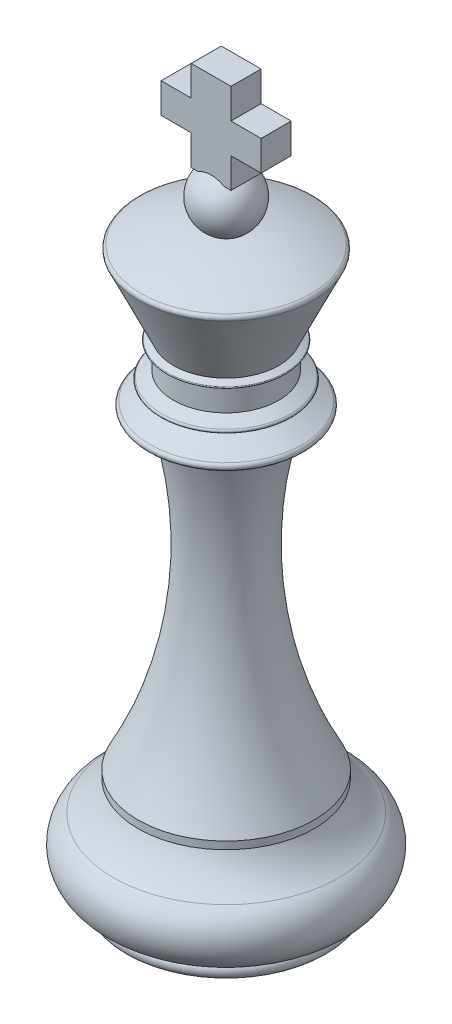
ISO-10303-21;
HEADER;
FILE_DESCRIPTION(('STEP AP214'),'2;1');
FILE_NAME('part.step','',(''),(''),'','','');
FILE_SCHEMA(('AUTOMOTIVE_DESIGN { 1 0 10303 214 1 1 1 1 }'));
ENDSEC;
DATA;
#1=APPLICATION_CONTEXT('core data for automotive mechanical design processes');
#2=APPLICATION_PROTOCOL_DEFINITION('international standard','automotive_design',2000,#1);
#3=PRODUCT_CONTEXT('',#1,'mechanical');
#4=PRODUCT('Part','Part','',(#3));
#5=PRODUCT_RELATED_PRODUCT_CATEGORY('part','',(#4));
#6=PRODUCT_DEFINITION_FORMATION('','',#4);
#7=PRODUCT_DEFINITION_CONTEXT('part definition',#1,'design');
#8=PRODUCT_DEFINITION('design','',#6,#7);
#9=PRODUCT_DEFINITION_SHAPE('','',#8);
#10=(LENGTH_UNIT() NAMED_UNIT(*) SI_UNIT(.MILLI.,.METRE.));
#11=(NAMED_UNIT(*) PLANE_ANGLE_UNIT() SI_UNIT($,.RADIAN.));
#12=(NAMED_UNIT(*) SI_UNIT($,.STERADIAN.) SOLID_ANGLE_UNIT());
#13=UNCERTAINTY_MEASURE_WITH_UNIT(LENGTH_MEASURE(1.E-05),#10,'distance_accuracy_value','');
#14=(GEOMETRIC_REPRESENTATION_CONTEXT(3) GLOBAL_UNCERTAINTY_ASSIGNED_CONTEXT((#13)) GLOBAL_UNIT_ASSIGNED_CONTEXT((#10,
#11,#12)) REPRESENTATION_CONTEXT('',''));
#15=CARTESIAN_POINT('',(0.,0.,0.));
#16=DIRECTION('',(0.,0.,1.));
#17=DIRECTION('',(1.,0.,0.));
#18=AXIS2_PLACEMENT_3D('',#15,#16,#17);
#19=CARTESIAN_POINT('',(0.,81.,0.));
#20=DIRECTION('',(0.,1.,0.));
#21=DIRECTION('',(-1.,0.,0.));
#22=AXIS2_PLACEMENT_3D('',#19,#20,#21);
#23=SPHERICAL_SURFACE('',#22,4.);
#24=CARTESIAN_POINT('',(0.,77.8401729525783,0.));
#25=DIRECTION('',(0.,1.,0.));
#26=DIRECTION('',(0.,0.,1.));
#27=AXIS2_PLACEMENT_3D('',#24,#25,#26);
#28=CIRCLE('',#27,2.45265020546794);
#29=CARTESIAN_POINT('',(0.,77.8401729525783,2.45265020546794));
#30=VERTEX_POINT('',#29);
#31=EDGE_CURVE('E181',#30,#30,#28,.T.);
#32=ORIENTED_EDGE('',*,*,#31,.T.);
#33=EDGE_LOOP('',(#32));
#34=FACE_BOUND('',#33,.T.);
#35=CARTESIAN_POINT('',(0.,84.,0.));
#36=DIRECTION('',(0.,1.,0.));
#37=DIRECTION('',(0.,0.,1.));
#38=AXIS2_PLACEMENT_3D('',#35,#36,#37);
#39=CIRCLE('',#38,2.64575131106459);
#40=CARTESIAN_POINT('',(1.73205080756887,84.,-2.));
#41=VERTEX_POINT('',#40);
#42=CARTESIAN_POINT('',(1.73205080756887,84.,2.));
#43=VERTEX_POINT('',#42);
#44=EDGE_CURVE('E53',#41,#43,#39,.F.);
#45=ORIENTED_EDGE('',*,*,#44,.T.);
#46=CARTESIAN_POINT('',(0.,81.,2.));
#47=DIRECTION('',(0.,0.,-1.));
#48=DIRECTION('',(-1.,0.,0.));
#49=AXIS2_PLACEMENT_3D('',#46,#47,#48);
#50=CIRCLE('',#49,3.46410161513775);
#51=CARTESIAN_POINT('',(-1.73205080756887,84.,2.));
#52=VERTEX_POINT('',#51);
#53=EDGE_CURVE('E11',#43,#52,#50,.F.);
#54=ORIENTED_EDGE('',*,*,#53,.T.);
#55=CARTESIAN_POINT('',(-1.73205080756887,84.,-2.));
#56=VERTEX_POINT('',#55);
#57=EDGE_CURVE('E43',#52,#56,#39,.F.);
#58=ORIENTED_EDGE('',*,*,#57,.T.);
#59=CARTESIAN_POINT('',(0.,81.,-2.));
#60=DIRECTION('',(0.,0.,-1.));
#61=DIRECTION('',(-1.,0.,0.));
#62=AXIS2_PLACEMENT_3D('',#59,#60,#61);
#63=CIRCLE('',#62,3.46410161513775);
#64=EDGE_CURVE('E220',#41,#56,#63,.F.);
#65=ORIENTED_EDGE('',*,*,#64,.F.);
#66=EDGE_LOOP('',(#45,#54,#58,#65));
#67=FACE_BOUND('',#66,.T.);
#68=ADVANCED_FACE('F35',(#34,#67),#23,.T.);
#69=CARTESIAN_POINT('',(0.,55.,0.));
#70=DIRECTION('',(0.,1.,0.));
#71=DIRECTION('',(0.,0.,1.));
#72=AXIS2_PLACEMENT_3D('',#69,#70,#71);
#73=CONICAL_SURFACE('',#72,7.00000000000001,1.10714871779409);
#74=CARTESIAN_POINT('',(0.,56.5527864045,0.));
#75=DIRECTION('',(0.,1.,0.));
#76=DIRECTION('',(0.,0.,1.));
#77=AXIS2_PLACEMENT_3D('',#74,#75,#76);
#78=CIRCLE('',#77,10.1055728090001);
#79=CARTESIAN_POINT('',(0.,56.5527864045,10.1055728090001));
#80=VERTEX_POINT('',#79);
#81=EDGE_CURVE('E217',#80,#80,#78,.T.);
#82=ORIENTED_EDGE('',*,*,#81,.F.);
#83=EDGE_LOOP('',(#82));
#84=FACE_BOUND('',#83,.T.);
#85=CARTESIAN_POINT('',(0.,55.,0.));
#86=DIRECTION('',(0.,1.,0.));
#87=DIRECTION('',(0.,0.,1.));
#88=AXIS2_PLACEMENT_3D('',#85,#86,#87);
#89=CIRCLE('',#88,7.00000000000001);
#90=CARTESIAN_POINT('',(0.,55.,7.00000000000001));
#91=VERTEX_POINT('',#90);
#92=EDGE_CURVE('E158',#91,#91,#89,.T.);
#93=ORIENTED_EDGE('',*,*,#92,.T.);
#94=EDGE_LOOP('',(#93));
#95=FACE_BOUND('',#94,.T.);
#96=ADVANCED_FACE('F37',(#84,#95),#73,.T.);
#97=CARTESIAN_POINT('',(0.,57.,0.));
#98=DIRECTION('',(0.,1.,0.));
#99=DIRECTION('',(0.,0.,1.));
#100=AXIS2_PLACEMENT_3D('',#97,#98,#99);
#101=TOROIDAL_SURFACE('',#100,9.88196601125011,0.500000000000002);
#102=CARTESIAN_POINT('',(0.,57.4472135955,0.));
#103=DIRECTION('',(0.,1.,0.));
#104=DIRECTION('',(0.,0.,1.));
#105=AXIS2_PLACEMENT_3D('',#102,#103,#104);
#106=CIRCLE('',#105,10.1055728090001);
#107=CARTESIAN_POINT('',(0.,57.4472135955,10.1055728090001));
#108=VERTEX_POINT('',#107);
#109=EDGE_CURVE('E214',#108,#108,#106,.T.);
#110=ORIENTED_EDGE('',*,*,#109,.F.);
#111=EDGE_LOOP('',(#110));
#112=FACE_BOUND('',#111,.T.);
#113=ORIENTED_EDGE('',*,*,#81,.T.);
#114=EDGE_LOOP('',(#113));
#115=FACE_BOUND('',#114,.T.);
#116=ADVANCED_FACE('F358',(#112,#115),#101,.T.);
#117=CARTESIAN_POINT('',(0.,57.4472135955,0.));
#118=DIRECTION('',(0.,-1.,0.));
#119=DIRECTION('',(0.,0.,-1.));
#120=AXIS2_PLACEMENT_3D('',#117,#118,#119);
#121=CONICAL_SURFACE('',#120,10.1055728090001,1.10714871779409);
#122=CARTESIAN_POINT('',(0.,59.,0.));
#123=DIRECTION('',(0.,1.,0.));
#124=DIRECTION('',(0.,0.,1.));
#125=AXIS2_PLACEMENT_3D('',#122,#123,#124);
#126=CIRCLE('',#125,7.);
#127=CARTESIAN_POINT('',(0.,59.,7.));
#128=VERTEX_POINT('',#127);
#129=EDGE_CURVE('E211',#128,#128,#126,.T.);
#130=ORIENTED_EDGE('',*,*,#129,.F.);
#131=EDGE_LOOP('',(#130));
#132=FACE_BOUND('',#131,.T.);
#133=ORIENTED_EDGE('',*,*,#109,.T.);
#134=EDGE_LOOP('',(#133));
#135=FACE_BOUND('',#134,.T.);
#136=ADVANCED_FACE('F403',(#132,#135),#121,.T.);
#137=CARTESIAN_POINT('',(0.,59.,0.));
#138=DIRECTION('',(0.,1.,0.));
#139=DIRECTION('',(0.,0.,1.));
#140=AXIS2_PLACEMENT_3D('',#137,#138,#139);
#141=CONICAL_SURFACE('',#140,7.,1.10714871779409);
#142=CARTESIAN_POINT('',(0.,59.77639320225,0.));
#143=DIRECTION('',(0.,1.,0.));
#144=DIRECTION('',(0.,0.,1.));
#145=AXIS2_PLACEMENT_3D('',#142,#143,#144);
#146=CIRCLE('',#145,8.55278640450005);
#147=CARTESIAN_POINT('',(0.,59.77639320225,8.55278640450005));
#148=VERTEX_POINT('',#147);
#149=EDGE_CURVE('E208',#148,#148,#146,.T.);
#150=ORIENTED_EDGE('',*,*,#149,.F.);
#151=EDGE_LOOP('',(#150));
#152=FACE_BOUND('',#151,.T.);
#153=ORIENTED_EDGE('',*,*,#129,.T.);
#154=EDGE_LOOP('',(#153));
#155=FACE_BOUND('',#154,.T.);
#156=ADVANCED_FACE('F399',(#152,#155),#141,.T.);
#157=CARTESIAN_POINT('',(0.,60.,0.));
#158=DIRECTION('',(0.,1.,0.));
#159=DIRECTION('',(0.,0.,1.));
#160=AXIS2_PLACEMENT_3D('',#157,#158,#159);
#161=TOROIDAL_SURFACE('',#160,8.44098300562506,0.249999999999998);
#162=CARTESIAN_POINT('',(0.,60.22360679775,0.));
#163=DIRECTION('',(0.,1.,0.));
#164=DIRECTION('',(0.,0.,1.));
#165=AXIS2_PLACEMENT_3D('',#162,#163,#164);
#166=CIRCLE('',#165,8.55278640450004);
#167=CARTESIAN_POINT('',(0.,60.22360679775,8.55278640450004));
#168=VERTEX_POINT('',#167);
#169=EDGE_CURVE('E205',#168,#168,#166,.T.);
#170=ORIENTED_EDGE('',*,*,#169,.F.);
#171=EDGE_LOOP('',(#170));
#172=FACE_BOUND('',#171,.T.);
#173=ORIENTED_EDGE('',*,*,#149,.T.);
#174=EDGE_LOOP('',(#173));
#175=FACE_BOUND('',#174,.T.);
#176=ADVANCED_FACE('F395',(#172,#175),#161,.T.);
#177=CARTESIAN_POINT('',(0.,60.22360679775,0.));
#178=DIRECTION('',(0.,-1.,0.));
#179=DIRECTION('',(0.,0.,-1.));
#180=AXIS2_PLACEMENT_3D('',#177,#178,#179);
#181=CONICAL_SURFACE('',#180,8.55278640450004,1.10714871779409);
#182=CARTESIAN_POINT('',(0.,61.,0.));
#183=DIRECTION('',(0.,1.,0.));
#184=DIRECTION('',(0.,0.,1.));
#185=AXIS2_PLACEMENT_3D('',#182,#183,#184);
#186=CIRCLE('',#185,7.);
#187=CARTESIAN_POINT('',(0.,61.,7.));
#188=VERTEX_POINT('',#187);
#189=EDGE_CURVE('E202',#188,#188,#186,.T.);
#190=ORIENTED_EDGE('',*,*,#189,.F.);
#191=EDGE_LOOP('',(#190));
#192=FACE_BOUND('',#191,.T.);
#193=ORIENTED_EDGE('',*,*,#169,.T.);
#194=EDGE_LOOP('',(#193));
#195=FACE_BOUND('',#194,.T.);
#196=ADVANCED_FACE('F391',(#192,#195),#181,.T.);
#197=CARTESIAN_POINT('',(0.,91.1598504758133,0.));
#198=DIRECTION('',(0.,1.,0.));
#199=DIRECTION('',(0.,0.,1.));
#200=AXIS2_PLACEMENT_3D('',#197,#198,#199);
#201=CYLINDRICAL_SURFACE('',#200,7.);
#202=CARTESIAN_POINT('',(0.,64.,0.));
#203=DIRECTION('',(0.,1.,0.));
#204=DIRECTION('',(0.,0.,1.));
#205=AXIS2_PLACEMENT_3D('',#202,#203,#204);
#206=CIRCLE('',#205,7.);
#207=CARTESIAN_POINT('',(0.,64.,7.));
#208=VERTEX_POINT('',#207);
#209=EDGE_CURVE('E199',#208,#208,#206,.T.);
#210=ORIENTED_EDGE('',*,*,#209,.F.);
#211=EDGE_LOOP('',(#210));
#212=FACE_BOUND('',#211,.T.);
#213=ORIENTED_EDGE('',*,*,#189,.T.);
#214=EDGE_LOOP('',(#213));
#215=FACE_BOUND('',#214,.T.);
#216=ADVANCED_FACE('F387',(#212,#215),#201,.T.);
#217=CARTESIAN_POINT('',(0.,64.,0.));
#218=DIRECTION('',(0.,1.,0.));
#219=DIRECTION('',(0.,0.,1.));
#220=AXIS2_PLACEMENT_3D('',#217,#218,#219);
#221=CONICAL_SURFACE('',#220,7.,1.1071487177941);
#222=CARTESIAN_POINT('',(0.,64.4105572809,0.));
#223=DIRECTION('',(0.,1.,0.));
#224=DIRECTION('',(0.,0.,1.));
#225=AXIS2_PLACEMENT_3D('',#222,#223,#224);
#226=CIRCLE('',#225,7.82111456180003);
#227=CARTESIAN_POINT('',(0.,64.4105572809,7.82111456180003));
#228=VERTEX_POINT('',#227);
#229=EDGE_CURVE('E196',#228,#228,#226,.T.);
#230=ORIENTED_EDGE('',*,*,#229,.F.);
#231=EDGE_LOOP('',(#230));
#232=FACE_BOUND('',#231,.T.);
#233=ORIENTED_EDGE('',*,*,#209,.T.);
#234=EDGE_LOOP('',(#233));
#235=FACE_BOUND('',#234,.T.);
#236=ADVANCED_FACE('F383',(#232,#235),#221,.T.);
#237=CARTESIAN_POINT('',(0.,64.5,0.));
#238=DIRECTION('',(0.,1.,0.));
#239=DIRECTION('',(0.,0.,1.));
#240=AXIS2_PLACEMENT_3D('',#237,#238,#239);
#241=TOROIDAL_SURFACE('',#240,7.77639320225003,0.100000000000004);
#242=CARTESIAN_POINT('',(0.,64.5894427191,0.));
#243=DIRECTION('',(0.,1.,0.));
#244=DIRECTION('',(0.,0.,1.));
#245=AXIS2_PLACEMENT_3D('',#242,#243,#244);
#246=CIRCLE('',#245,7.82111456180002);
#247=CARTESIAN_POINT('',(0.,64.5894427191,7.82111456180002));
#248=VERTEX_POINT('',#247);
#249=EDGE_CURVE('E193',#248,#248,#246,.T.);
#250=ORIENTED_EDGE('',*,*,#249,.F.);
#251=EDGE_LOOP('',(#250));
#252=FACE_BOUND('',#251,.T.);
#253=ORIENTED_EDGE('',*,*,#229,.T.);
#254=EDGE_LOOP('',(#253));
#255=FACE_BOUND('',#254,.T.);
#256=ADVANCED_FACE('F379',(#252,#255),#241,.T.);
#257=CARTESIAN_POINT('',(0.,64.5894427191,0.));
#258=DIRECTION('',(0.,-1.,0.));
#259=DIRECTION('',(0.,0.,-1.));
#260=AXIS2_PLACEMENT_3D('',#257,#258,#259);
#261=CONICAL_SURFACE('',#260,7.82111456180002,1.10714871779408);
#262=CARTESIAN_POINT('',(0.,65.,0.));
#263=DIRECTION('',(0.,1.,0.));
#264=DIRECTION('',(0.,0.,1.));
#265=AXIS2_PLACEMENT_3D('',#262,#263,#264);
#266=CIRCLE('',#265,7.);
#267=CARTESIAN_POINT('',(0.,65.,7.));
#268=VERTEX_POINT('',#267);
#269=EDGE_CURVE('E190',#268,#268,#266,.T.);
#270=ORIENTED_EDGE('',*,*,#269,.F.);
#271=EDGE_LOOP('',(#270));
#272=FACE_BOUND('',#271,.T.);
#273=ORIENTED_EDGE('',*,*,#249,.T.);
#274=EDGE_LOOP('',(#273));
#275=FACE_BOUND('',#274,.T.);
#276=ADVANCED_FACE('F375',(#272,#275),#261,.T.);
#277=CARTESIAN_POINT('',(0.,65.,0.));
#278=DIRECTION('',(0.,1.,0.));
#279=DIRECTION('',(0.,0.,1.));
#280=AXIS2_PLACEMENT_3D('',#277,#278,#279);
#281=CONICAL_SURFACE('',#280,7.,0.436332312998576);
#282=CARTESIAN_POINT('',(0.,74.787096875235,0.));
#283=DIRECTION('',(0.,1.,0.));
#284=DIRECTION('',(0.,0.,1.));
#285=AXIS2_PLACEMENT_3D('',#282,#283,#284);
#286=CIRCLE('',#285,11.5637982240269);
#287=CARTESIAN_POINT('',(0.,74.787096875235,11.5637982240269));
#288=VERTEX_POINT('',#287);
#289=EDGE_CURVE('E187',#288,#288,#286,.T.);
#290=ORIENTED_EDGE('',*,*,#289,.F.);
#291=EDGE_LOOP('',(#290));
#292=FACE_BOUND('',#291,.T.);
#293=ORIENTED_EDGE('',*,*,#269,.T.);
#294=EDGE_LOOP('',(#293));
#295=FACE_BOUND('',#294,.T.);
#296=ADVANCED_FACE('F371',(#292,#295),#281,.T.);
#297=CARTESIAN_POINT('',(0.,74.9984060061053,0.));
#298=DIRECTION('',(0.,1.,0.));
#299=DIRECTION('',(0.,0.,1.));
#300=AXIS2_PLACEMENT_3D('',#297,#298,#299);
#301=TOROIDAL_SURFACE('',#300,11.1106443305085,0.499999999999999);
#302=CARTESIAN_POINT('',(0.,75.4551358020621,0.));
#303=DIRECTION('',(0.,1.,0.));
#304=DIRECTION('',(0.,0.,1.));
#305=AXIS2_PLACEMENT_3D('',#302,#303,#304);
#306=CIRCLE('',#305,11.314109053459);
#307=CARTESIAN_POINT('',(0.,75.4551358020621,11.314109053459));
#308=VERTEX_POINT('',#307);
#309=EDGE_CURVE('E184',#308,#308,#306,.T.);
#310=ORIENTED_EDGE('',*,*,#309,.F.);
#311=EDGE_LOOP('',(#310));
#312=FACE_BOUND('',#311,.T.);
#313=ORIENTED_EDGE('',*,*,#289,.T.);
#314=EDGE_LOOP('',(#313));
#315=FACE_BOUND('',#314,.T.);
#316=ADVANCED_FACE('F367',(#312,#315),#301,.T.);
#317=CARTESIAN_POINT('',(0.,48.5080778406138,0.));
#318=DIRECTION('',(0.,1.,0.));
#319=DIRECTION('',(0.,0.,1.));
#320=AXIS2_PLACEMENT_3D('',#317,#318,#319);
#321=DEGENERATE_TOROIDAL_SURFACE('',#320,0.690309600617773,29.5,.F.);
#322=ORIENTED_EDGE('',*,*,#31,.F.);
#323=EDGE_LOOP('',(#322));
#324=FACE_BOUND('',#323,.T.);
#325=ORIENTED_EDGE('',*,*,#309,.T.);
#326=EDGE_LOOP('',(#325));
#327=FACE_BOUND('',#326,.T.);
#328=ADVANCED_FACE('F364',(#324,#327),#321,.F.);
#329=CARTESIAN_POINT('',(0.,0.,0.));
#330=DIRECTION('',(0.,1.,0.));
#331=DIRECTION('',(0.,0.,1.));
#332=AXIS2_PLACEMENT_3D('',#329,#330,#331);
#333=PLANE('',#332);
#334=CARTESIAN_POINT('',(0.,0.,0.));
#335=DIRECTION('',(0.,1.,0.));
#336=DIRECTION('',(0.,0.,1.));
#337=AXIS2_PLACEMENT_3D('',#334,#335,#336);
#338=CIRCLE('',#337,12.5);
#339=CARTESIAN_POINT('',(0.,0.,12.5));
#340=VERTEX_POINT('',#339);
#341=EDGE_CURVE('E178',#340,#340,#338,.T.);
#342=ORIENTED_EDGE('',*,*,#341,.F.);
#343=EDGE_LOOP('',(#342));
#344=FACE_BOUND('',#343,.T.);
#345=ADVANCED_FACE('F362',(#344),#333,.F.);
#346=CARTESIAN_POINT('',(0.,1.,0.));
#347=DIRECTION('',(0.,1.,0.));
#348=DIRECTION('',(0.,0.,1.));
#349=AXIS2_PLACEMENT_3D('',#346,#347,#348);
#350=TOROIDAL_SURFACE('',#349,12.5,1.);
#351=CARTESIAN_POINT('',(0.,2.,0.));
#352=DIRECTION('',(0.,1.,0.));
#353=DIRECTION('',(0.,0.,1.));
#354=AXIS2_PLACEMENT_3D('',#351,#352,#353);
#355=CIRCLE('',#354,12.5);
#356=CARTESIAN_POINT('',(0.,2.,12.5));
#357=VERTEX_POINT('',#356);
#358=EDGE_CURVE('E175',#357,#357,#355,.T.);
#359=ORIENTED_EDGE('',*,*,#358,.F.);
#360=EDGE_LOOP('',(#359));
#361=FACE_BOUND('',#360,.T.);
#362=ORIENTED_EDGE('',*,*,#341,.T.);
#363=EDGE_LOOP('',(#362));
#364=FACE_BOUND('',#363,.T.);
#365=ADVANCED_FACE('F438',(#361,#364),#350,.T.);
#366=CARTESIAN_POINT('',(0.,6.390625,0.));
#367=DIRECTION('',(0.,1.,0.));
#368=DIRECTION('',(0.,0.,1.));
#369=AXIS2_PLACEMENT_3D('',#366,#367,#368);
#370=TOROIDAL_SURFACE('',#369,12.5,4.390625);
#371=CARTESIAN_POINT('',(0.,9.99999999999999,0.));
#372=DIRECTION('',(0.,1.,0.));
#373=DIRECTION('',(0.,0.,1.));
#374=AXIS2_PLACEMENT_3D('',#371,#372,#373);
#375=CIRCLE('',#374,15.);
#376=CARTESIAN_POINT('',(0.,9.99999999999999,15.));
#377=VERTEX_POINT('',#376);
#378=EDGE_CURVE('E172',#377,#377,#375,.T.);
#379=ORIENTED_EDGE('',*,*,#378,.F.);
#380=EDGE_LOOP('',(#379));
#381=FACE_BOUND('',#380,.T.);
#382=ORIENTED_EDGE('',*,*,#358,.T.);
#383=EDGE_LOOP('',(#382));
#384=FACE_BOUND('',#383,.T.);
#385=ADVANCED_FACE('F432',(#381,#384),#370,.T.);
#386=CARTESIAN_POINT('',(0.,17.8096085409253,0.));
#387=DIRECTION('',(0.,1.,0.));
#388=DIRECTION('',(0.,0.,1.));
#389=AXIS2_PLACEMENT_3D('',#386,#387,#388);
#390=TOROIDAL_SURFACE('',#389,20.4092526690391,9.5);
#391=CARTESIAN_POINT('',(0.,14.,0.));
#392=DIRECTION('',(0.,1.,0.));
#393=DIRECTION('',(0.,0.,1.));
#394=AXIS2_PLACEMENT_3D('',#391,#392,#393);
#395=CIRCLE('',#394,11.7065586743666);
#396=CARTESIAN_POINT('',(0.,14.,11.7065586743666));
#397=VERTEX_POINT('',#396);
#398=EDGE_CURVE('E169',#397,#397,#395,.T.);
#399=ORIENTED_EDGE('',*,*,#398,.F.);
#400=EDGE_LOOP('',(#399));
#401=FACE_BOUND('',#400,.T.);
#402=ORIENTED_EDGE('',*,*,#378,.T.);
#403=EDGE_LOOP('',(#402));
#404=FACE_BOUND('',#403,.T.);
#405=ADVANCED_FACE('F426',(#401,#404),#390,.F.);
#406=CARTESIAN_POINT('',(0.,91.1598504758133,0.));
#407=DIRECTION('',(0.,1.,0.));
#408=DIRECTION('',(0.,0.,1.));
#409=AXIS2_PLACEMENT_3D('',#406,#407,#408);
#410=CYLINDRICAL_SURFACE('',#409,11.7065586743666);
#411=CARTESIAN_POINT('',(0.,15.,0.));
#412=DIRECTION('',(0.,1.,0.));
#413=DIRECTION('',(0.,0.,1.));
#414=AXIS2_PLACEMENT_3D('',#411,#412,#413);
#415=CIRCLE('',#414,11.7065586743666);
#416=CARTESIAN_POINT('',(0.,15.,11.7065586743666));
#417=VERTEX_POINT('',#416);
#418=EDGE_CURVE('E161',#417,#417,#415,.T.);
#419=ORIENTED_EDGE('',*,*,#418,.F.);
#420=EDGE_LOOP('',(#419));
#421=FACE_BOUND('',#420,.T.);
#422=ORIENTED_EDGE('',*,*,#398,.T.);
#423=EDGE_LOOP('',(#422));
#424=FACE_BOUND('',#423,.T.);
#425=ADVANCED_FACE('F420',(#421,#424),#410,.T.);
#426=CARTESIAN_POINT('',(0.,40.9808622858206,0.));
#427=DIRECTION('',(0.,1.,0.));
#428=DIRECTION('',(0.,0.,1.));
#429=AXIS2_PLACEMENT_3D('',#426,#427,#428);
#430=TOROIDAL_SURFACE('',#429,60.1833035618405,55.);
#431=ORIENTED_EDGE('',*,*,#92,.F.);
#432=EDGE_LOOP('',(#431));
#433=FACE_BOUND('',#432,.T.);
#434=ORIENTED_EDGE('',*,*,#418,.T.);
#435=EDGE_LOOP('',(#434));
#436=FACE_BOUND('',#435,.T.);
#437=ADVANCED_FACE('F417',(#433,#436),#430,.F.);
#438=CARTESIAN_POINT('',(-2.646,84.,2.));
#439=DIRECTION('',(0.,1.,0.));
#440=DIRECTION('',(0.,0.,1.));
#441=AXIS2_PLACEMENT_3D('',#438,#439,#440);
#442=PLANE('',#441);
#443=ORIENTED_EDGE('',*,*,#57,.F.);
#444=DIRECTION('',(1.,0.,0.));
#445=VECTOR('',#444,1.);
#446=CARTESIAN_POINT('',(-2.646,84.,2.));
#447=LINE('',#446,#445);
#448=CARTESIAN_POINT('',(-2.646,84.,2.));
#449=VERTEX_POINT('',#448);
#450=EDGE_CURVE('E587',#449,#52,#447,.T.);
#451=ORIENTED_EDGE('',*,*,#450,.F.);
#452=DIRECTION('',(0.,0.,-1.));
#453=VECTOR('',#452,1.);
#454=CARTESIAN_POINT('',(-2.646,84.,2.));
#455=LINE('',#454,#453);
#456=CARTESIAN_POINT('',(-2.646,84.,-2.));
#457=VERTEX_POINT('',#456);
#458=EDGE_CURVE('E139',#449,#457,#455,.T.);
#459=ORIENTED_EDGE('',*,*,#458,.T.);
#460=DIRECTION('',(1.,0.,0.));
#461=VECTOR('',#460,1.);
#462=CARTESIAN_POINT('',(-2.646,84.,-2.));
#463=LINE('',#462,#461);
#464=EDGE_CURVE('E228',#457,#56,#463,.T.);
#465=ORIENTED_EDGE('',*,*,#464,.T.);
#466=EDGE_LOOP('',(#443,#451,#459,#465));
#467=FACE_BOUND('',#466,.T.);
#468=ADVANCED_FACE('F231',(#467),#442,.F.);
#469=CARTESIAN_POINT('',(-2.646,88.,2.));
#470=DIRECTION('',(0.,1.,0.));
#471=DIRECTION('',(0.,0.,1.));
#472=AXIS2_PLACEMENT_3D('',#469,#470,#471);
#473=PLANE('',#472);
#474=DIRECTION('',(1.,0.,0.));
#475=VECTOR('',#474,1.);
#476=CARTESIAN_POINT('',(-2.646,88.,-2.));
#477=LINE('',#476,#475);
#478=CARTESIAN_POINT('',(-6.646,88.,-2.));
#479=VERTEX_POINT('',#478);
#480=CARTESIAN_POINT('',(-2.646,88.,-2.));
#481=VERTEX_POINT('',#480);
#482=EDGE_CURVE('E157',#479,#481,#477,.T.);
#483=ORIENTED_EDGE('',*,*,#482,.T.);
#484=DIRECTION('',(0.,0.,-1.));
#485=VECTOR('',#484,1.);
#486=CARTESIAN_POINT('',(-2.646,88.,2.));
#487=LINE('',#486,#485);
#488=CARTESIAN_POINT('',(-2.646,88.,2.));
#489=VERTEX_POINT('',#488);
#490=EDGE_CURVE('E136',#489,#481,#487,.T.);
#491=ORIENTED_EDGE('',*,*,#490,.F.);
#492=DIRECTION('',(1.,0.,0.));
#493=VECTOR('',#492,1.);
#494=CARTESIAN_POINT('',(-2.646,88.,2.));
#495=LINE('',#494,#493);
#496=CARTESIAN_POINT('',(-6.646,88.,2.));
#497=VERTEX_POINT('',#496);
#498=EDGE_CURVE('E144',#497,#489,#495,.T.);
#499=ORIENTED_EDGE('',*,*,#498,.F.);
#500=DIRECTION('',(0.,0.,-1.));
#501=VECTOR('',#500,1.);
#502=CARTESIAN_POINT('',(-6.646,88.,2.));
#503=LINE('',#502,#501);
#504=EDGE_CURVE('E254',#497,#479,#503,.T.);
#505=ORIENTED_EDGE('',*,*,#504,.T.);
#506=EDGE_LOOP('',(#483,#491,#499,#505));
#507=FACE_BOUND('',#506,.T.);
#508=ADVANCED_FACE('F155',(#507),#473,.F.);
#509=CARTESIAN_POINT('',(-2.646,84.,2.));
#510=DIRECTION('',(1.,0.,0.));
#511=DIRECTION('',(0.,0.,-1.));
#512=AXIS2_PLACEMENT_3D('',#509,#510,#511);
#513=PLANE('',#512);
#514=DIRECTION('',(0.,-1.,0.));
#515=VECTOR('',#514,1.);
#516=CARTESIAN_POINT('',(-2.646,84.,-2.));
#517=LINE('',#516,#515);
#518=EDGE_CURVE('E236',#481,#457,#517,.T.);
#519=ORIENTED_EDGE('',*,*,#518,.T.);
#520=ORIENTED_EDGE('',*,*,#458,.F.);
#521=DIRECTION('',(0.,-1.,0.));
#522=VECTOR('',#521,1.);
#523=CARTESIAN_POINT('',(-2.646,84.,2.));
#524=LINE('',#523,#522);
#525=EDGE_CURVE('E132',#489,#449,#524,.T.);
#526=ORIENTED_EDGE('',*,*,#525,.F.);
#527=ORIENTED_EDGE('',*,*,#490,.T.);
#528=EDGE_LOOP('',(#519,#520,#526,#527));
#529=FACE_BOUND('',#528,.T.);
#530=ADVANCED_FACE('F134',(#529),#513,.F.);
#531=ORIENTED_EDGE('',*,*,#44,.F.);
#532=CARTESIAN_POINT('',(2.646,84.,-2.));
#533=VERTEX_POINT('',#532);
#534=EDGE_CURVE('E230',#41,#533,#463,.T.);
#535=ORIENTED_EDGE('',*,*,#534,.T.);
#536=DIRECTION('',(0.,0.,-1.));
#537=VECTOR('',#536,1.);
#538=CARTESIAN_POINT('',(2.646,84.,2.));
#539=LINE('',#538,#537);
#540=CARTESIAN_POINT('',(2.646,84.,2.));
#541=VERTEX_POINT('',#540);
#542=EDGE_CURVE('E163',#541,#533,#539,.T.);
#543=ORIENTED_EDGE('',*,*,#542,.F.);
#544=EDGE_CURVE('E143',#43,#541,#447,.T.);
#545=ORIENTED_EDGE('',*,*,#544,.F.);
#546=EDGE_LOOP('',(#531,#535,#543,#545));
#547=FACE_BOUND('',#546,.T.);
#548=ADVANCED_FACE('F481',(#547),#442,.F.);
#549=CARTESIAN_POINT('',(2.646,84.,2.));
#550=DIRECTION('',(-1.,0.,0.));
#551=DIRECTION('',(0.,0.,1.));
#552=AXIS2_PLACEMENT_3D('',#549,#550,#551);
#553=PLANE('',#552);
#554=DIRECTION('',(0.,1.,0.));
#555=VECTOR('',#554,1.);
#556=CARTESIAN_POINT('',(2.646,84.,-2.));
#557=LINE('',#556,#555);
#558=CARTESIAN_POINT('',(2.646,88.,-2.));
#559=VERTEX_POINT('',#558);
#560=EDGE_CURVE('E232',#533,#559,#557,.T.);
#561=ORIENTED_EDGE('',*,*,#560,.T.);
#562=DIRECTION('',(0.,0.,-1.));
#563=VECTOR('',#562,1.);
#564=CARTESIAN_POINT('',(2.646,88.,2.));
#565=LINE('',#564,#563);
#566=CARTESIAN_POINT('',(2.646,88.,2.));
#567=VERTEX_POINT('',#566);
#568=EDGE_CURVE('E277',#567,#559,#565,.T.);
#569=ORIENTED_EDGE('',*,*,#568,.F.);
#570=DIRECTION('',(0.,1.,0.));
#571=VECTOR('',#570,1.);
#572=CARTESIAN_POINT('',(2.646,84.,2.));
#573=LINE('',#572,#571);
#574=EDGE_CURVE('E285',#541,#567,#573,.T.);
#575=ORIENTED_EDGE('',*,*,#574,.F.);
#576=ORIENTED_EDGE('',*,*,#542,.T.);
#577=EDGE_LOOP('',(#561,#569,#575,#576));
#578=FACE_BOUND('',#577,.T.);
#579=ADVANCED_FACE('F283',(#578),#553,.F.);
#580=CARTESIAN_POINT('',(2.646,88.,2.));
#581=DIRECTION('',(0.,1.,0.));
#582=DIRECTION('',(0.,0.,1.));
#583=AXIS2_PLACEMENT_3D('',#580,#581,#582);
#584=PLANE('',#583);
#585=DIRECTION('',(1.,0.,0.));
#586=VECTOR('',#585,1.);
#587=CARTESIAN_POINT('',(2.646,88.,-2.));
#588=LINE('',#587,#586);
#589=CARTESIAN_POINT('',(6.646,88.,-2.));
#590=VERTEX_POINT('',#589);
#591=EDGE_CURVE('E234',#559,#590,#588,.T.);
#592=ORIENTED_EDGE('',*,*,#591,.T.);
#593=DIRECTION('',(0.,0.,-1.));
#594=VECTOR('',#593,1.);
#595=CARTESIAN_POINT('',(6.646,88.,2.));
#596=LINE('',#595,#594);
#597=CARTESIAN_POINT('',(6.646,88.,2.));
#598=VERTEX_POINT('',#597);
#599=EDGE_CURVE('E274',#598,#590,#596,.T.);
#600=ORIENTED_EDGE('',*,*,#599,.F.);
#601=DIRECTION('',(1.,0.,0.));
#602=VECTOR('',#601,1.);
#603=CARTESIAN_POINT('',(2.646,88.,2.));
#604=LINE('',#603,#602);
#605=EDGE_CURVE('E302',#567,#598,#604,.T.);
#606=ORIENTED_EDGE('',*,*,#605,.F.);
#607=ORIENTED_EDGE('',*,*,#568,.T.);
#608=EDGE_LOOP('',(#592,#600,#606,#607));
#609=FACE_BOUND('',#608,.T.);
#610=ADVANCED_FACE('F293',(#609),#584,.F.);
#611=CARTESIAN_POINT('',(6.646,88.,2.));
#612=DIRECTION('',(-1.,0.,0.));
#613=DIRECTION('',(0.,-1.,0.));
#614=AXIS2_PLACEMENT_3D('',#611,#612,#613);
#615=PLANE('',#614);
#616=DIRECTION('',(0.,1.,0.));
#617=VECTOR('',#616,1.);
#618=CARTESIAN_POINT('',(6.646,88.,-2.));
#619=LINE('',#618,#617);
#620=CARTESIAN_POINT('',(6.646,92.,-2.));
#621=VERTEX_POINT('',#620);
#622=EDGE_CURVE('E241',#590,#621,#619,.T.);
#623=ORIENTED_EDGE('',*,*,#622,.T.);
#624=DIRECTION('',(0.,0.,-1.));
#625=VECTOR('',#624,1.);
#626=CARTESIAN_POINT('',(6.646,92.,2.));
#627=LINE('',#626,#625);
#628=CARTESIAN_POINT('',(6.646,92.,2.));
#629=VERTEX_POINT('',#628);
#630=EDGE_CURVE('E271',#629,#621,#627,.T.);
#631=ORIENTED_EDGE('',*,*,#630,.F.);
#632=DIRECTION('',(0.,1.,0.));
#633=VECTOR('',#632,1.);
#634=CARTESIAN_POINT('',(6.646,88.,2.));
#635=LINE('',#634,#633);
#636=EDGE_CURVE('E299',#598,#629,#635,.T.);
#637=ORIENTED_EDGE('',*,*,#636,.F.);
#638=ORIENTED_EDGE('',*,*,#599,.T.);
#639=EDGE_LOOP('',(#623,#631,#637,#638));
#640=FACE_BOUND('',#639,.T.);
#641=ADVANCED_FACE('F297',(#640),#615,.F.);
#642=CARTESIAN_POINT('',(6.646,92.,2.));
#643=DIRECTION('',(0.,-1.,0.));
#644=DIRECTION('',(0.,0.,-1.));
#645=AXIS2_PLACEMENT_3D('',#642,#643,#644);
#646=PLANE('',#645);
#647=DIRECTION('',(-1.,0.,0.));
#648=VECTOR('',#647,1.);
#649=CARTESIAN_POINT('',(6.646,92.,-2.));
#650=LINE('',#649,#648);
#651=CARTESIAN_POINT('',(2.646,92.,-2.));
#652=VERTEX_POINT('',#651);
#653=EDGE_CURVE('E243',#621,#652,#650,.T.);
#654=ORIENTED_EDGE('',*,*,#653,.T.);
#655=DIRECTION('',(0.,0.,-1.));
#656=VECTOR('',#655,1.);
#657=CARTESIAN_POINT('',(2.646,92.,2.));
#658=LINE('',#657,#656);
#659=CARTESIAN_POINT('',(2.646,92.,2.));
#660=VERTEX_POINT('',#659);
#661=EDGE_CURVE('E268',#660,#652,#658,.T.);
#662=ORIENTED_EDGE('',*,*,#661,.F.);
#663=DIRECTION('',(-1.,0.,0.));
#664=VECTOR('',#663,1.);
#665=CARTESIAN_POINT('',(6.646,92.,2.));
#666=LINE('',#665,#664);
#667=EDGE_CURVE('E301',#629,#660,#666,.T.);
#668=ORIENTED_EDGE('',*,*,#667,.F.);
#669=ORIENTED_EDGE('',*,*,#630,.T.);
#670=EDGE_LOOP('',(#654,#662,#668,#669));
#671=FACE_BOUND('',#670,.T.);
#672=ADVANCED_FACE('F341',(#671),#646,.F.);
#673=CARTESIAN_POINT('',(2.646,92.,2.));
#674=DIRECTION('',(-1.,0.,0.));
#675=DIRECTION('',(0.,-1.,0.));
#676=AXIS2_PLACEMENT_3D('',#673,#674,#675);
#677=PLANE('',#676);
#678=DIRECTION('',(0.,1.,0.));
#679=VECTOR('',#678,1.);
#680=CARTESIAN_POINT('',(2.646,92.,-2.));
#681=LINE('',#680,#679);
#682=CARTESIAN_POINT('',(2.646,96.,-2.));
#683=VERTEX_POINT('',#682);
#684=EDGE_CURVE('E245',#652,#683,#681,.T.);
#685=ORIENTED_EDGE('',*,*,#684,.T.);
#686=DIRECTION('',(0.,0.,-1.));
#687=VECTOR('',#686,1.);
#688=CARTESIAN_POINT('',(2.646,96.,2.));
#689=LINE('',#688,#687);
#690=CARTESIAN_POINT('',(2.646,96.,2.));
#691=VERTEX_POINT('',#690);
#692=EDGE_CURVE('E265',#691,#683,#689,.T.);
#693=ORIENTED_EDGE('',*,*,#692,.F.);
#694=DIRECTION('',(0.,1.,0.));
#695=VECTOR('',#694,1.);
#696=CARTESIAN_POINT('',(2.646,92.,2.));
#697=LINE('',#696,#695);
#698=EDGE_CURVE('E304',#660,#691,#697,.T.);
#699=ORIENTED_EDGE('',*,*,#698,.F.);
#700=ORIENTED_EDGE('',*,*,#661,.T.);
#701=EDGE_LOOP('',(#685,#693,#699,#700));
#702=FACE_BOUND('',#701,.T.);
#703=ADVANCED_FACE('F338',(#702),#677,.F.);
#704=CARTESIAN_POINT('',(2.646,96.,2.));
#705=DIRECTION('',(0.,-1.,0.));
#706=DIRECTION('',(0.,0.,-1.));
#707=AXIS2_PLACEMENT_3D('',#704,#705,#706);
#708=PLANE('',#707);
#709=DIRECTION('',(-1.,0.,0.));
#710=VECTOR('',#709,1.);
#711=CARTESIAN_POINT('',(2.646,96.,-2.));
#712=LINE('',#711,#710);
#713=CARTESIAN_POINT('',(-2.646,96.,-2.));
#714=VERTEX_POINT('',#713);
#715=EDGE_CURVE('E247',#683,#714,#712,.T.);
#716=ORIENTED_EDGE('',*,*,#715,.T.);
#717=DIRECTION('',(0.,0.,-1.));
#718=VECTOR('',#717,1.);
#719=CARTESIAN_POINT('',(-2.646,96.,2.));
#720=LINE('',#719,#718);
#721=CARTESIAN_POINT('',(-2.646,96.,2.));
#722=VERTEX_POINT('',#721);
#723=EDGE_CURVE('E262',#722,#714,#720,.T.);
#724=ORIENTED_EDGE('',*,*,#723,.F.);
#725=DIRECTION('',(-1.,0.,0.));
#726=VECTOR('',#725,1.);
#727=CARTESIAN_POINT('',(2.646,96.,2.));
#728=LINE('',#727,#726);
#729=EDGE_CURVE('E310',#691,#722,#728,.T.);
#730=ORIENTED_EDGE('',*,*,#729,.F.);
#731=ORIENTED_EDGE('',*,*,#692,.T.);
#732=EDGE_LOOP('',(#716,#724,#730,#731));
#733=FACE_BOUND('',#732,.T.);
#734=ADVANCED_FACE('F333',(#733),#708,.F.);
#735=CARTESIAN_POINT('',(-2.646,92.,2.));
#736=DIRECTION('',(1.,0.,0.));
#737=DIRECTION('',(0.,1.,0.));
#738=AXIS2_PLACEMENT_3D('',#735,#736,#737);
#739=PLANE('',#738);
#740=DIRECTION('',(0.,-1.,0.));
#741=VECTOR('',#740,1.);
#742=CARTESIAN_POINT('',(-2.646,92.,-2.));
#743=LINE('',#742,#741);
#744=CARTESIAN_POINT('',(-2.646,92.,-2.));
#745=VERTEX_POINT('',#744);
#746=EDGE_CURVE('E249',#714,#745,#743,.T.);
#747=ORIENTED_EDGE('',*,*,#746,.T.);
#748=DIRECTION('',(0.,0.,-1.));
#749=VECTOR('',#748,1.);
#750=CARTESIAN_POINT('',(-2.646,92.,2.));
#751=LINE('',#750,#749);
#752=CARTESIAN_POINT('',(-2.646,92.,2.));
#753=VERTEX_POINT('',#752);
#754=EDGE_CURVE('E259',#753,#745,#751,.T.);
#755=ORIENTED_EDGE('',*,*,#754,.F.);
#756=DIRECTION('',(0.,-1.,0.));
#757=VECTOR('',#756,1.);
#758=CARTESIAN_POINT('',(-2.646,92.,2.));
#759=LINE('',#758,#757);
#760=EDGE_CURVE('E312',#722,#753,#759,.T.);
#761=ORIENTED_EDGE('',*,*,#760,.F.);
#762=ORIENTED_EDGE('',*,*,#723,.T.);
#763=EDGE_LOOP('',(#747,#755,#761,#762));
#764=FACE_BOUND('',#763,.T.);
#765=ADVANCED_FACE('F328',(#764),#739,.F.);
#766=CARTESIAN_POINT('',(-6.646,92.,2.));
#767=DIRECTION('',(0.,-1.,0.));
#768=DIRECTION('',(0.,0.,-1.));
#769=AXIS2_PLACEMENT_3D('',#766,#767,#768);
#770=PLANE('',#769);
#771=DIRECTION('',(-1.,0.,0.));
#772=VECTOR('',#771,1.);
#773=CARTESIAN_POINT('',(-6.646,92.,-2.));
#774=LINE('',#773,#772);
#775=CARTESIAN_POINT('',(-6.646,92.,-2.));
#776=VERTEX_POINT('',#775);
#777=EDGE_CURVE('E251',#745,#776,#774,.T.);
#778=ORIENTED_EDGE('',*,*,#777,.T.);
#779=DIRECTION('',(0.,0.,-1.));
#780=VECTOR('',#779,1.);
#781=CARTESIAN_POINT('',(-6.646,92.,2.));
#782=LINE('',#781,#780);
#783=CARTESIAN_POINT('',(-6.646,92.,2.));
#784=VERTEX_POINT('',#783);
#785=EDGE_CURVE('E256',#784,#776,#782,.T.);
#786=ORIENTED_EDGE('',*,*,#785,.F.);
#787=DIRECTION('',(-1.,0.,0.));
#788=VECTOR('',#787,1.);
#789=CARTESIAN_POINT('',(-6.646,92.,2.));
#790=LINE('',#789,#788);
#791=EDGE_CURVE('E314',#753,#784,#790,.T.);
#792=ORIENTED_EDGE('',*,*,#791,.F.);
#793=ORIENTED_EDGE('',*,*,#754,.T.);
#794=EDGE_LOOP('',(#778,#786,#792,#793));
#795=FACE_BOUND('',#794,.T.);
#796=ADVANCED_FACE('F324',(#795),#770,.F.);
#797=CARTESIAN_POINT('',(-6.646,88.,2.));
#798=DIRECTION('',(1.,0.,0.));
#799=DIRECTION('',(0.,1.,0.));
#800=AXIS2_PLACEMENT_3D('',#797,#798,#799);
#801=PLANE('',#800);
#802=DIRECTION('',(0.,-1.,0.));
#803=VECTOR('',#802,1.);
#804=CARTESIAN_POINT('',(-6.646,88.,-2.));
#805=LINE('',#804,#803);
#806=EDGE_CURVE('E153',#776,#479,#805,.T.);
#807=ORIENTED_EDGE('',*,*,#806,.T.);
#808=ORIENTED_EDGE('',*,*,#504,.F.);
#809=DIRECTION('',(0.,-1.,0.));
#810=VECTOR('',#809,1.);
#811=CARTESIAN_POINT('',(-6.646,88.,2.));
#812=LINE('',#811,#810);
#813=EDGE_CURVE('E149',#784,#497,#812,.T.);
#814=ORIENTED_EDGE('',*,*,#813,.F.);
#815=ORIENTED_EDGE('',*,*,#785,.T.);
#816=EDGE_LOOP('',(#807,#808,#814,#815));
#817=FACE_BOUND('',#816,.T.);
#818=ADVANCED_FACE('F320',(#817),#801,.F.);
#819=CARTESIAN_POINT('',(0.,0.,2.));
#820=DIRECTION('',(0.,0.,-1.));
#821=DIRECTION('',(-1.,0.,0.));
#822=AXIS2_PLACEMENT_3D('',#819,#820,#821);
#823=PLANE('',#822);
#824=ORIENTED_EDGE('',*,*,#53,.F.);
#825=ORIENTED_EDGE('',*,*,#544,.T.);
#826=ORIENTED_EDGE('',*,*,#574,.T.);
#827=ORIENTED_EDGE('',*,*,#605,.T.);
#828=ORIENTED_EDGE('',*,*,#636,.T.);
#829=ORIENTED_EDGE('',*,*,#667,.T.);
#830=ORIENTED_EDGE('',*,*,#698,.T.);
#831=ORIENTED_EDGE('',*,*,#729,.T.);
#832=ORIENTED_EDGE('',*,*,#760,.T.);
#833=ORIENTED_EDGE('',*,*,#791,.T.);
#834=ORIENTED_EDGE('',*,*,#813,.T.);
#835=ORIENTED_EDGE('',*,*,#498,.T.);
#836=ORIENTED_EDGE('',*,*,#525,.T.);
#837=ORIENTED_EDGE('',*,*,#450,.T.);
#838=EDGE_LOOP('',(#824,#825,#826,#827,#828,#829,#830,#831,#832,#833,#834,#835,#836,#837));
#839=FACE_BOUND('',#838,.T.);
#840=ADVANCED_FACE('F147',(#839),#823,.F.);
#841=CARTESIAN_POINT('',(0.,0.,-2.));
#842=DIRECTION('',(0.,0.,-1.));
#843=DIRECTION('',(-1.,0.,0.));
#844=AXIS2_PLACEMENT_3D('',#841,#842,#843);
#845=PLANE('',#844);
#846=ORIENTED_EDGE('',*,*,#534,.F.);
#847=ORIENTED_EDGE('',*,*,#64,.T.);
#848=ORIENTED_EDGE('',*,*,#464,.F.);
#849=ORIENTED_EDGE('',*,*,#518,.F.);
#850=ORIENTED_EDGE('',*,*,#482,.F.);
#851=ORIENTED_EDGE('',*,*,#806,.F.);
#852=ORIENTED_EDGE('',*,*,#777,.F.);
#853=ORIENTED_EDGE('',*,*,#746,.F.);
#854=ORIENTED_EDGE('',*,*,#715,.F.);
#855=ORIENTED_EDGE('',*,*,#684,.F.);
#856=ORIENTED_EDGE('',*,*,#653,.F.);
#857=ORIENTED_EDGE('',*,*,#622,.F.);
#858=ORIENTED_EDGE('',*,*,#591,.F.);
#859=ORIENTED_EDGE('',*,*,#560,.F.);
#860=EDGE_LOOP('',(#846,#847,#848,#849,#850,#851,#852,#853,#854,#855,#856,#857,#858,#859));
#861=FACE_BOUND('',#860,.T.);
#862=ADVANCED_FACE('F227',(#861),#845,.T.);
#863=CLOSED_SHELL('',(#68,#96,#116,#136,#156,#176,#196,#216,#236,#256,#276,#296,#316,#328,#345,
#365,#385,#405,#425,#437,#468,#508,#530,#548,#579,#610,#641,#672,#703,#734,#765,#796,#818,#840,#862));
#864=MANIFOLD_SOLID_BREP('B2',#863);
#865=ADVANCED_BREP_SHAPE_REPRESENTATION('',(#18,#864),#14);
#866=SHAPE_DEFINITION_REPRESENTATION(#9,#865);
ENDSEC;
END-ISO-10303-21;
